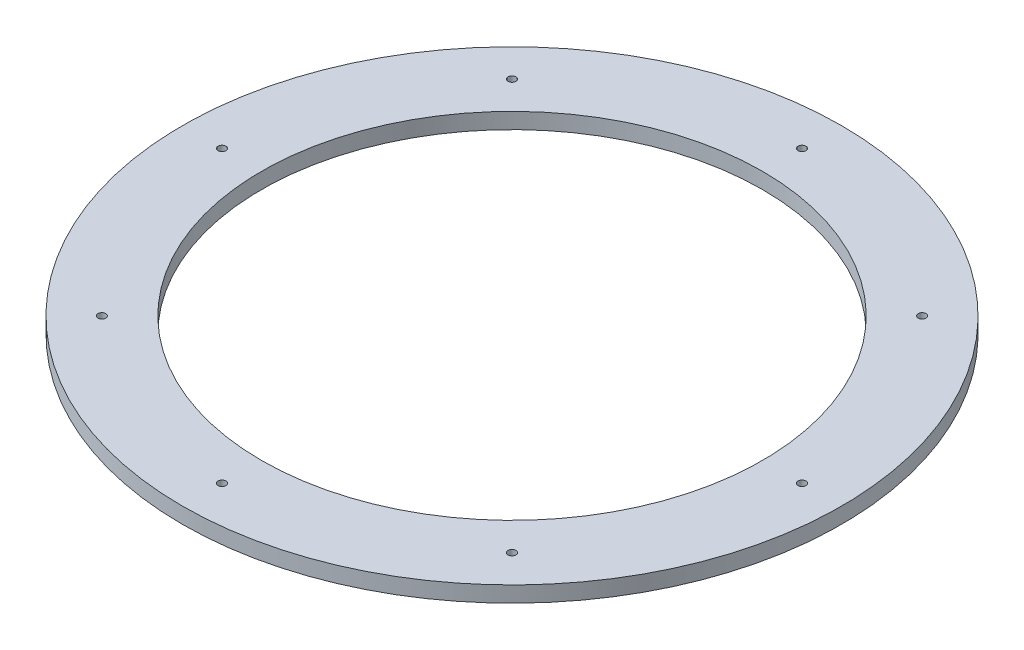
ISO-10303-21;
HEADER;
FILE_DESCRIPTION(('STEP AP214'),'2;1');
FILE_NAME('part.step','',(''),(''),'','','');
FILE_SCHEMA(('AUTOMOTIVE_DESIGN { 1 0 10303 214 1 1 1 1 }'));
ENDSEC;
DATA;
#1=APPLICATION_CONTEXT('core data for automotive mechanical design processes');
#2=APPLICATION_PROTOCOL_DEFINITION('international standard','automotive_design',2000,#1);
#3=PRODUCT_CONTEXT('',#1,'mechanical');
#4=PRODUCT('Part','Part','',(#3));
#5=PRODUCT_RELATED_PRODUCT_CATEGORY('part','',(#4));
#6=PRODUCT_DEFINITION_FORMATION('','',#4);
#7=PRODUCT_DEFINITION_CONTEXT('part definition',#1,'design');
#8=PRODUCT_DEFINITION('design','',#6,#7);
#9=PRODUCT_DEFINITION_SHAPE('','',#8);
#10=(LENGTH_UNIT() NAMED_UNIT(*) SI_UNIT(.MILLI.,.METRE.));
#11=(NAMED_UNIT(*) PLANE_ANGLE_UNIT() SI_UNIT($,.RADIAN.));
#12=(NAMED_UNIT(*) SI_UNIT($,.STERADIAN.) SOLID_ANGLE_UNIT());
#13=UNCERTAINTY_MEASURE_WITH_UNIT(LENGTH_MEASURE(1.E-05),#10,'distance_accuracy_value','');
#14=(GEOMETRIC_REPRESENTATION_CONTEXT(3) GLOBAL_UNCERTAINTY_ASSIGNED_CONTEXT((#13)) GLOBAL_UNIT_ASSIGNED_CONTEXT((#10,
#11,#12)) REPRESENTATION_CONTEXT('',''));
#15=CARTESIAN_POINT('',(0.,0.,0.));
#16=DIRECTION('',(0.,0.,1.));
#17=DIRECTION('',(1.,0.,0.));
#18=AXIS2_PLACEMENT_3D('',#15,#16,#17);
#19=CARTESIAN_POINT('',(0.,6.,0.));
#20=DIRECTION('',(0.,1.,0.));
#21=DIRECTION('',(0.,0.,1.));
#22=AXIS2_PLACEMENT_3D('',#19,#20,#21);
#23=PLANE('',#22);
#24=CARTESIAN_POINT('',(-110.,6.,0.));
#25=DIRECTION('',(0.,1.,0.));
#26=DIRECTION('',(0.,0.,-1.));
#27=AXIS2_PLACEMENT_3D('',#24,#25,#26);
#28=CIRCLE('',#27,1.5);
#29=CARTESIAN_POINT('',(-110.,6.,-1.5));
#30=VERTEX_POINT('',#29);
#31=EDGE_CURVE('E112',#30,#30,#28,.T.);
#32=ORIENTED_EDGE('',*,*,#31,.F.);
#33=EDGE_LOOP('',(#32));
#34=FACE_BOUND('',#33,.T.);
#35=CARTESIAN_POINT('',(0.,6.,-110.));
#36=DIRECTION('',(0.,1.,0.));
#37=DIRECTION('',(0.,0.,-1.));
#38=AXIS2_PLACEMENT_3D('',#35,#36,#37);
#39=CIRCLE('',#38,1.5);
#40=CARTESIAN_POINT('',(0.,6.,-111.5));
#41=VERTEX_POINT('',#40);
#42=EDGE_CURVE('E96',#41,#41,#39,.T.);
#43=ORIENTED_EDGE('',*,*,#42,.F.);
#44=EDGE_LOOP('',(#43));
#45=FACE_BOUND('',#44,.T.);
#46=CARTESIAN_POINT('',(110.,6.,0.));
#47=DIRECTION('',(0.,1.,0.));
#48=DIRECTION('',(0.,0.,1.));
#49=AXIS2_PLACEMENT_3D('',#46,#47,#48);
#50=CIRCLE('',#49,1.5);
#51=CARTESIAN_POINT('',(110.,6.,1.5));
#52=VERTEX_POINT('',#51);
#53=EDGE_CURVE('E80',#52,#52,#50,.T.);
#54=ORIENTED_EDGE('',*,*,#53,.F.);
#55=EDGE_LOOP('',(#54));
#56=FACE_BOUND('',#55,.T.);
#57=CARTESIAN_POINT('',(0.,6.,110.));
#58=DIRECTION('',(0.,1.,0.));
#59=DIRECTION('',(0.,0.,1.));
#60=AXIS2_PLACEMENT_3D('',#57,#58,#59);
#61=CIRCLE('',#60,1.5);
#62=CARTESIAN_POINT('',(0.,6.,111.5));
#63=VERTEX_POINT('',#62);
#64=EDGE_CURVE('E64',#63,#63,#61,.T.);
#65=ORIENTED_EDGE('',*,*,#64,.F.);
#66=EDGE_LOOP('',(#65));
#67=FACE_BOUND('',#66,.T.);
#68=CARTESIAN_POINT('',(0.,6.,0.));
#69=DIRECTION('',(0.,1.,0.));
#70=DIRECTION('',(0.,0.,1.));
#71=AXIS2_PLACEMENT_3D('',#68,#69,#70);
#72=CIRCLE('',#71,125.);
#73=CARTESIAN_POINT('',(0.,6.,125.));
#74=VERTEX_POINT('',#73);
#75=EDGE_CURVE('E10',#74,#74,#72,.T.);
#76=ORIENTED_EDGE('',*,*,#75,.T.);
#77=EDGE_LOOP('',(#76));
#78=FACE_BOUND('',#77,.T.);
#79=CARTESIAN_POINT('',(0.,6.,0.));
#80=DIRECTION('',(0.,1.,0.));
#81=DIRECTION('',(0.,0.,1.));
#82=AXIS2_PLACEMENT_3D('',#79,#80,#81);
#83=CIRCLE('',#82,95.);
#84=CARTESIAN_POINT('',(0.,6.,95.));
#85=VERTEX_POINT('',#84);
#86=EDGE_CURVE('E58',#85,#85,#83,.T.);
#87=ORIENTED_EDGE('',*,*,#86,.F.);
#88=EDGE_LOOP('',(#87));
#89=FACE_BOUND('',#88,.T.);
#90=CARTESIAN_POINT('',(77.7817459305202,6.,77.7817459305202));
#91=DIRECTION('',(0.,1.,0.));
#92=DIRECTION('',(0.,0.,1.));
#93=AXIS2_PLACEMENT_3D('',#90,#91,#92);
#94=CIRCLE('',#93,1.5);
#95=CARTESIAN_POINT('',(77.7817459305202,6.,79.2817459305202));
#96=VERTEX_POINT('',#95);
#97=EDGE_CURVE('E72',#96,#96,#94,.T.);
#98=ORIENTED_EDGE('',*,*,#97,.F.);
#99=EDGE_LOOP('',(#98));
#100=FACE_BOUND('',#99,.T.);
#101=CARTESIAN_POINT('',(77.7817459305202,6.,-77.7817459305202));
#102=DIRECTION('',(0.,1.,0.));
#103=DIRECTION('',(0.,0.,1.));
#104=AXIS2_PLACEMENT_3D('',#101,#102,#103);
#105=CIRCLE('',#104,1.5);
#106=CARTESIAN_POINT('',(77.7817459305202,6.,-76.2817459305202));
#107=VERTEX_POINT('',#106);
#108=EDGE_CURVE('E88',#107,#107,#105,.T.);
#109=ORIENTED_EDGE('',*,*,#108,.F.);
#110=EDGE_LOOP('',(#109));
#111=FACE_BOUND('',#110,.T.);
#112=CARTESIAN_POINT('',(-77.7817459305202,6.,-77.7817459305202));
#113=DIRECTION('',(0.,1.,0.));
#114=DIRECTION('',(0.,0.,-1.));
#115=AXIS2_PLACEMENT_3D('',#112,#113,#114);
#116=CIRCLE('',#115,1.49999999999996);
#117=CARTESIAN_POINT('',(-77.7817459305202,6.,-79.2817459305202));
#118=VERTEX_POINT('',#117);
#119=EDGE_CURVE('E104',#118,#118,#116,.T.);
#120=ORIENTED_EDGE('',*,*,#119,.F.);
#121=EDGE_LOOP('',(#120));
#122=FACE_BOUND('',#121,.T.);
#123=CARTESIAN_POINT('',(-77.7817459305203,6.,77.7817459305203));
#124=DIRECTION('',(0.,1.,0.));
#125=DIRECTION('',(0.,0.,-1.));
#126=AXIS2_PLACEMENT_3D('',#123,#124,#125);
#127=CIRCLE('',#126,1.49999999999994);
#128=CARTESIAN_POINT('',(-77.7817459305203,6.,76.2817459305203));
#129=VERTEX_POINT('',#128);
#130=EDGE_CURVE('E120',#129,#129,#127,.T.);
#131=ORIENTED_EDGE('',*,*,#130,.F.);
#132=EDGE_LOOP('',(#131));
#133=FACE_BOUND('',#132,.T.);
#134=ADVANCED_FACE('F45',(#34,#45,#56,#67,#78,#89,#100,#111,#122,#133),#23,.T.);
#135=CARTESIAN_POINT('',(0.,0.,0.));
#136=DIRECTION('',(0.,1.,0.));
#137=DIRECTION('',(0.,0.,1.));
#138=AXIS2_PLACEMENT_3D('',#135,#136,#137);
#139=PLANE('',#138);
#140=CARTESIAN_POINT('',(0.,0.,0.));
#141=DIRECTION('',(0.,1.,0.));
#142=DIRECTION('',(0.,0.,1.));
#143=AXIS2_PLACEMENT_3D('',#140,#141,#142);
#144=CIRCLE('',#143,125.);
#145=CARTESIAN_POINT('',(0.,0.,125.));
#146=VERTEX_POINT('',#145);
#147=EDGE_CURVE('E49',#146,#146,#144,.T.);
#148=ORIENTED_EDGE('',*,*,#147,.F.);
#149=EDGE_LOOP('',(#148));
#150=FACE_BOUND('',#149,.T.);
#151=CARTESIAN_POINT('',(0.,0.,0.));
#152=DIRECTION('',(0.,1.,0.));
#153=DIRECTION('',(0.,0.,1.));
#154=AXIS2_PLACEMENT_3D('',#151,#152,#153);
#155=CIRCLE('',#154,95.);
#156=CARTESIAN_POINT('',(0.,0.,95.));
#157=VERTEX_POINT('',#156);
#158=EDGE_CURVE('E60',#157,#157,#155,.T.);
#159=ORIENTED_EDGE('',*,*,#158,.T.);
#160=EDGE_LOOP('',(#159));
#161=FACE_BOUND('',#160,.T.);
#162=CARTESIAN_POINT('',(0.,0.,110.));
#163=DIRECTION('',(0.,1.,0.));
#164=DIRECTION('',(0.,0.,1.));
#165=AXIS2_PLACEMENT_3D('',#162,#163,#164);
#166=CIRCLE('',#165,1.5);
#167=CARTESIAN_POINT('',(0.,0.,111.5));
#168=VERTEX_POINT('',#167);
#169=EDGE_CURVE('E68',#168,#168,#166,.T.);
#170=ORIENTED_EDGE('',*,*,#169,.T.);
#171=EDGE_LOOP('',(#170));
#172=FACE_BOUND('',#171,.T.);
#173=CARTESIAN_POINT('',(77.7817459305202,0.,77.7817459305202));
#174=DIRECTION('',(0.,1.,0.));
#175=DIRECTION('',(0.,0.,1.));
#176=AXIS2_PLACEMENT_3D('',#173,#174,#175);
#177=CIRCLE('',#176,1.5);
#178=CARTESIAN_POINT('',(77.7817459305202,0.,79.2817459305202));
#179=VERTEX_POINT('',#178);
#180=EDGE_CURVE('E76',#179,#179,#177,.T.);
#181=ORIENTED_EDGE('',*,*,#180,.T.);
#182=EDGE_LOOP('',(#181));
#183=FACE_BOUND('',#182,.T.);
#184=CARTESIAN_POINT('',(110.,0.,0.));
#185=DIRECTION('',(0.,1.,0.));
#186=DIRECTION('',(0.,0.,1.));
#187=AXIS2_PLACEMENT_3D('',#184,#185,#186);
#188=CIRCLE('',#187,1.5);
#189=CARTESIAN_POINT('',(110.,0.,1.5));
#190=VERTEX_POINT('',#189);
#191=EDGE_CURVE('E84',#190,#190,#188,.T.);
#192=ORIENTED_EDGE('',*,*,#191,.T.);
#193=EDGE_LOOP('',(#192));
#194=FACE_BOUND('',#193,.T.);
#195=CARTESIAN_POINT('',(77.7817459305202,0.,-77.7817459305202));
#196=DIRECTION('',(0.,1.,0.));
#197=DIRECTION('',(0.,0.,1.));
#198=AXIS2_PLACEMENT_3D('',#195,#196,#197);
#199=CIRCLE('',#198,1.5);
#200=CARTESIAN_POINT('',(77.7817459305202,0.,-76.2817459305202));
#201=VERTEX_POINT('',#200);
#202=EDGE_CURVE('E92',#201,#201,#199,.T.);
#203=ORIENTED_EDGE('',*,*,#202,.T.);
#204=EDGE_LOOP('',(#203));
#205=FACE_BOUND('',#204,.T.);
#206=CARTESIAN_POINT('',(0.,0.,-110.));
#207=DIRECTION('',(0.,1.,0.));
#208=DIRECTION('',(0.,0.,-1.));
#209=AXIS2_PLACEMENT_3D('',#206,#207,#208);
#210=CIRCLE('',#209,1.5);
#211=CARTESIAN_POINT('',(0.,0.,-111.5));
#212=VERTEX_POINT('',#211);
#213=EDGE_CURVE('E100',#212,#212,#210,.T.);
#214=ORIENTED_EDGE('',*,*,#213,.T.);
#215=EDGE_LOOP('',(#214));
#216=FACE_BOUND('',#215,.T.);
#217=CARTESIAN_POINT('',(-77.7817459305202,0.,-77.7817459305202));
#218=DIRECTION('',(0.,1.,0.));
#219=DIRECTION('',(0.,0.,-1.));
#220=AXIS2_PLACEMENT_3D('',#217,#218,#219);
#221=CIRCLE('',#220,1.49999999999996);
#222=CARTESIAN_POINT('',(-77.7817459305202,0.,-79.2817459305202));
#223=VERTEX_POINT('',#222);
#224=EDGE_CURVE('E108',#223,#223,#221,.T.);
#225=ORIENTED_EDGE('',*,*,#224,.T.);
#226=EDGE_LOOP('',(#225));
#227=FACE_BOUND('',#226,.T.);
#228=CARTESIAN_POINT('',(-110.,0.,0.));
#229=DIRECTION('',(0.,1.,0.));
#230=DIRECTION('',(0.,0.,-1.));
#231=AXIS2_PLACEMENT_3D('',#228,#229,#230);
#232=CIRCLE('',#231,1.5);
#233=CARTESIAN_POINT('',(-110.,0.,-1.5));
#234=VERTEX_POINT('',#233);
#235=EDGE_CURVE('E116',#234,#234,#232,.T.);
#236=ORIENTED_EDGE('',*,*,#235,.T.);
#237=EDGE_LOOP('',(#236));
#238=FACE_BOUND('',#237,.T.);
#239=CARTESIAN_POINT('',(-77.7817459305203,0.,77.7817459305203));
#240=DIRECTION('',(0.,1.,0.));
#241=DIRECTION('',(0.,0.,-1.));
#242=AXIS2_PLACEMENT_3D('',#239,#240,#241);
#243=CIRCLE('',#242,1.49999999999994);
#244=CARTESIAN_POINT('',(-77.7817459305203,0.,76.2817459305203));
#245=VERTEX_POINT('',#244);
#246=EDGE_CURVE('E124',#245,#245,#243,.T.);
#247=ORIENTED_EDGE('',*,*,#246,.T.);
#248=EDGE_LOOP('',(#247));
#249=FACE_BOUND('',#248,.T.);
#250=ADVANCED_FACE('F136',(#150,#161,#172,#183,#194,#205,#216,#227,#238,#249),#139,.F.);
#251=CARTESIAN_POINT('',(0.,6.,0.));
#252=DIRECTION('',(0.,-1.,0.));
#253=DIRECTION('',(0.,0.,-1.));
#254=AXIS2_PLACEMENT_3D('',#251,#252,#253);
#255=CYLINDRICAL_SURFACE('',#254,125.);
#256=ORIENTED_EDGE('',*,*,#75,.F.);
#257=EDGE_LOOP('',(#256));
#258=FACE_BOUND('',#257,.T.);
#259=ORIENTED_EDGE('',*,*,#147,.T.);
#260=EDGE_LOOP('',(#259));
#261=FACE_BOUND('',#260,.T.);
#262=ADVANCED_FACE('F47',(#258,#261),#255,.T.);
#263=CARTESIAN_POINT('',(0.,6.,0.));
#264=DIRECTION('',(0.,-1.,0.));
#265=DIRECTION('',(0.,0.,-1.));
#266=AXIS2_PLACEMENT_3D('',#263,#264,#265);
#267=CYLINDRICAL_SURFACE('',#266,95.);
#268=ORIENTED_EDGE('',*,*,#86,.T.);
#269=EDGE_LOOP('',(#268));
#270=FACE_BOUND('',#269,.T.);
#271=ORIENTED_EDGE('',*,*,#158,.F.);
#272=EDGE_LOOP('',(#271));
#273=FACE_BOUND('',#272,.T.);
#274=ADVANCED_FACE('F146',(#270,#273),#267,.F.);
#275=CARTESIAN_POINT('',(0.,6.,110.));
#276=DIRECTION('',(0.,-1.,0.));
#277=DIRECTION('',(0.,0.,-1.));
#278=AXIS2_PLACEMENT_3D('',#275,#276,#277);
#279=CYLINDRICAL_SURFACE('',#278,1.5);
#280=ORIENTED_EDGE('',*,*,#64,.T.);
#281=EDGE_LOOP('',(#280));
#282=FACE_BOUND('',#281,.T.);
#283=ORIENTED_EDGE('',*,*,#169,.F.);
#284=EDGE_LOOP('',(#283));
#285=FACE_BOUND('',#284,.T.);
#286=ADVANCED_FACE('F149',(#282,#285),#279,.F.);
#287=CARTESIAN_POINT('',(77.7817459305202,6.,77.7817459305202));
#288=DIRECTION('',(0.,-1.,0.));
#289=DIRECTION('',(0.,0.,-1.));
#290=AXIS2_PLACEMENT_3D('',#287,#288,#289);
#291=CYLINDRICAL_SURFACE('',#290,1.5);
#292=ORIENTED_EDGE('',*,*,#97,.T.);
#293=EDGE_LOOP('',(#292));
#294=FACE_BOUND('',#293,.T.);
#295=ORIENTED_EDGE('',*,*,#180,.F.);
#296=EDGE_LOOP('',(#295));
#297=FACE_BOUND('',#296,.T.);
#298=ADVANCED_FACE('F153',(#294,#297),#291,.F.);
#299=CARTESIAN_POINT('',(110.,6.,0.));
#300=DIRECTION('',(0.,-1.,0.));
#301=DIRECTION('',(0.,0.,-1.));
#302=AXIS2_PLACEMENT_3D('',#299,#300,#301);
#303=CYLINDRICAL_SURFACE('',#302,1.5);
#304=ORIENTED_EDGE('',*,*,#53,.T.);
#305=EDGE_LOOP('',(#304));
#306=FACE_BOUND('',#305,.T.);
#307=ORIENTED_EDGE('',*,*,#191,.F.);
#308=EDGE_LOOP('',(#307));
#309=FACE_BOUND('',#308,.T.);
#310=ADVANCED_FACE('F157',(#306,#309),#303,.F.);
#311=CARTESIAN_POINT('',(77.7817459305202,6.,-77.7817459305202));
#312=DIRECTION('',(0.,-1.,0.));
#313=DIRECTION('',(0.,0.,-1.));
#314=AXIS2_PLACEMENT_3D('',#311,#312,#313);
#315=CYLINDRICAL_SURFACE('',#314,1.5);
#316=ORIENTED_EDGE('',*,*,#108,.T.);
#317=EDGE_LOOP('',(#316));
#318=FACE_BOUND('',#317,.T.);
#319=ORIENTED_EDGE('',*,*,#202,.F.);
#320=EDGE_LOOP('',(#319));
#321=FACE_BOUND('',#320,.T.);
#322=ADVANCED_FACE('F161',(#318,#321),#315,.F.);
#323=CARTESIAN_POINT('',(0.,6.,-110.));
#324=DIRECTION('',(0.,-1.,0.));
#325=DIRECTION('',(0.,0.,-1.));
#326=AXIS2_PLACEMENT_3D('',#323,#324,#325);
#327=CYLINDRICAL_SURFACE('',#326,1.5);
#328=ORIENTED_EDGE('',*,*,#42,.T.);
#329=EDGE_LOOP('',(#328));
#330=FACE_BOUND('',#329,.T.);
#331=ORIENTED_EDGE('',*,*,#213,.F.);
#332=EDGE_LOOP('',(#331));
#333=FACE_BOUND('',#332,.T.);
#334=ADVANCED_FACE('F165',(#330,#333),#327,.F.);
#335=CARTESIAN_POINT('',(-77.7817459305202,6.,-77.7817459305202));
#336=DIRECTION('',(0.,-1.,0.));
#337=DIRECTION('',(0.,0.,-1.));
#338=AXIS2_PLACEMENT_3D('',#335,#336,#337);
#339=CYLINDRICAL_SURFACE('',#338,1.49999999999996);
#340=ORIENTED_EDGE('',*,*,#119,.T.);
#341=EDGE_LOOP('',(#340));
#342=FACE_BOUND('',#341,.T.);
#343=ORIENTED_EDGE('',*,*,#224,.F.);
#344=EDGE_LOOP('',(#343));
#345=FACE_BOUND('',#344,.T.);
#346=ADVANCED_FACE('F169',(#342,#345),#339,.F.);
#347=CARTESIAN_POINT('',(-110.,6.,0.));
#348=DIRECTION('',(0.,-1.,0.));
#349=DIRECTION('',(0.,0.,-1.));
#350=AXIS2_PLACEMENT_3D('',#347,#348,#349);
#351=CYLINDRICAL_SURFACE('',#350,1.5);
#352=ORIENTED_EDGE('',*,*,#31,.T.);
#353=EDGE_LOOP('',(#352));
#354=FACE_BOUND('',#353,.T.);
#355=ORIENTED_EDGE('',*,*,#235,.F.);
#356=EDGE_LOOP('',(#355));
#357=FACE_BOUND('',#356,.T.);
#358=ADVANCED_FACE('F173',(#354,#357),#351,.F.);
#359=CARTESIAN_POINT('',(-77.7817459305203,6.,77.7817459305203));
#360=DIRECTION('',(0.,-1.,0.));
#361=DIRECTION('',(0.,0.,-1.));
#362=AXIS2_PLACEMENT_3D('',#359,#360,#361);
#363=CYLINDRICAL_SURFACE('',#362,1.49999999999994);
#364=ORIENTED_EDGE('',*,*,#130,.T.);
#365=EDGE_LOOP('',(#364));
#366=FACE_BOUND('',#365,.T.);
#367=ORIENTED_EDGE('',*,*,#246,.F.);
#368=EDGE_LOOP('',(#367));
#369=FACE_BOUND('',#368,.T.);
#370=ADVANCED_FACE('F132',(#366,#369),#363,.F.);
#371=CLOSED_SHELL('',(#134,#250,#262,#274,#286,#298,#310,#322,#334,#346,#358,#370));
#372=MANIFOLD_SOLID_BREP('B2',#371);
#373=ADVANCED_BREP_SHAPE_REPRESENTATION('',(#18,#372),#14);
#374=SHAPE_DEFINITION_REPRESENTATION(#9,#373);
ENDSEC;
END-ISO-10303-21;
